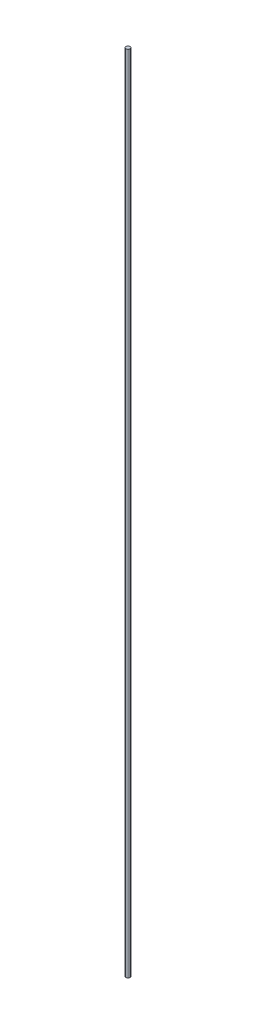
ISO-10303-21;
HEADER;
FILE_DESCRIPTION(('STEP AP214'),'2;1');
FILE_NAME('part.step','',(''),(''),'','','');
FILE_SCHEMA(('AUTOMOTIVE_DESIGN { 1 0 10303 214 1 1 1 1 }'));
ENDSEC;
DATA;
#1=APPLICATION_CONTEXT('core data for automotive mechanical design processes');
#2=APPLICATION_PROTOCOL_DEFINITION('international standard','automotive_design',2000,#1);
#3=PRODUCT_CONTEXT('',#1,'mechanical');
#4=PRODUCT('Part','Part','',(#3));
#5=PRODUCT_RELATED_PRODUCT_CATEGORY('part','',(#4));
#6=PRODUCT_DEFINITION_FORMATION('','',#4);
#7=PRODUCT_DEFINITION_CONTEXT('part definition',#1,'design');
#8=PRODUCT_DEFINITION('design','',#6,#7);
#9=PRODUCT_DEFINITION_SHAPE('','',#8);
#10=(LENGTH_UNIT() NAMED_UNIT(*) SI_UNIT(.MILLI.,.METRE.));
#11=(NAMED_UNIT(*) PLANE_ANGLE_UNIT() SI_UNIT($,.RADIAN.));
#12=(NAMED_UNIT(*) SI_UNIT($,.STERADIAN.) SOLID_ANGLE_UNIT());
#13=UNCERTAINTY_MEASURE_WITH_UNIT(LENGTH_MEASURE(1.E-05),#10,'distance_accuracy_value','');
#14=(GEOMETRIC_REPRESENTATION_CONTEXT(3) GLOBAL_UNCERTAINTY_ASSIGNED_CONTEXT((#13)) GLOBAL_UNIT_ASSIGNED_CONTEXT((#10,
#11,#12)) REPRESENTATION_CONTEXT('',''));
#15=CARTESIAN_POINT('',(0.,0.,0.));
#16=DIRECTION('',(0.,0.,1.));
#17=DIRECTION('',(1.,0.,0.));
#18=AXIS2_PLACEMENT_3D('',#15,#16,#17);
#19=CARTESIAN_POINT('',(0.,1270.,0.));
#20=DIRECTION('',(0.,-1.,0.));
#21=DIRECTION('',(0.,0.,-1.));
#22=AXIS2_PLACEMENT_3D('',#19,#20,#21);
#23=CYLINDRICAL_SURFACE('',#22,3.175);
#24=CARTESIAN_POINT('',(0.,1270.,0.));
#25=DIRECTION('',(0.,1.,0.));
#26=DIRECTION('',(0.,0.,1.));
#27=AXIS2_PLACEMENT_3D('',#24,#25,#26);
#28=CIRCLE('',#27,3.175);
#29=CARTESIAN_POINT('',(0.,1270.,-3.175));
#30=VERTEX_POINT('',#29);
#31=EDGE_CURVE('E10',#30,#30,#28,.T.);
#32=CARTESIAN_POINT('',(0.,0.,0.));
#33=DIRECTION('',(0.,1.,0.));
#34=DIRECTION('',(0.,0.,1.));
#35=AXIS2_PLACEMENT_3D('',#32,#33,#34);
#36=CIRCLE('',#35,3.175);
#37=CARTESIAN_POINT('',(0.,-2.22044604925031E-13,-3.175));
#38=VERTEX_POINT('',#37);
#39=EDGE_CURVE('E40',#38,#38,#36,.T.);
#40=CARTESIAN_POINT('',(0.,1270.,-3.175));
#41=CARTESIAN_POINT('',(0.,1256.77083333333,-3.175));
#42=CARTESIAN_POINT('',(0.,1243.54166666667,-3.175));
#43=CARTESIAN_POINT('',(0.,1217.08333333333,-3.175));
#44=CARTESIAN_POINT('',(0.,1203.85416666667,-3.175));
#45=CARTESIAN_POINT('',(0.,1177.39583333333,-3.175));
#46=CARTESIAN_POINT('',(0.,1164.16666666667,-3.175));
#47=CARTESIAN_POINT('',(0.,1137.70833333333,-3.175));
#48=CARTESIAN_POINT('',(0.,1124.47916666667,-3.175));
#49=CARTESIAN_POINT('',(0.,1098.02083333333,-3.175));
#50=CARTESIAN_POINT('',(0.,1084.79166666667,-3.175));
#51=CARTESIAN_POINT('',(0.,1058.33333333333,-3.175));
#52=CARTESIAN_POINT('',(0.,1045.10416666667,-3.175));
#53=CARTESIAN_POINT('',(0.,1018.64583333333,-3.175));
#54=CARTESIAN_POINT('',(0.,1005.41666666667,-3.175));
#55=CARTESIAN_POINT('',(0.,978.958333333333,-3.175));
#56=CARTESIAN_POINT('',(0.,965.729166666667,-3.175));
#57=CARTESIAN_POINT('',(0.,939.270833333333,-3.175));
#58=CARTESIAN_POINT('',(0.,926.041666666667,-3.175));
#59=CARTESIAN_POINT('',(0.,899.583333333333,-3.175));
#60=CARTESIAN_POINT('',(0.,886.354166666666,-3.175));
#61=CARTESIAN_POINT('',(0.,859.895833333333,-3.175));
#62=CARTESIAN_POINT('',(0.,846.666666666666,-3.175));
#63=CARTESIAN_POINT('',(0.,820.208333333333,-3.175));
#64=CARTESIAN_POINT('',(0.,806.979166666667,-3.175));
#65=CARTESIAN_POINT('',(0.,780.520833333333,-3.175));
#66=CARTESIAN_POINT('',(0.,767.291666666667,-3.175));
#67=CARTESIAN_POINT('',(0.,740.833333333333,-3.175));
#68=CARTESIAN_POINT('',(0.,727.604166666667,-3.175));
#69=CARTESIAN_POINT('',(0.,701.145833333333,-3.175));
#70=CARTESIAN_POINT('',(0.,687.916666666666,-3.175));
#71=CARTESIAN_POINT('',(0.,661.458333333333,-3.175));
#72=CARTESIAN_POINT('',(0.,648.229166666666,-3.175));
#73=CARTESIAN_POINT('',(0.,621.770833333333,-3.175));
#74=CARTESIAN_POINT('',(0.,608.541666666666,-3.175));
#75=CARTESIAN_POINT('',(0.,582.083333333333,-3.175));
#76=CARTESIAN_POINT('',(0.,568.854166666666,-3.175));
#77=CARTESIAN_POINT('',(0.,542.395833333333,-3.175));
#78=CARTESIAN_POINT('',(0.,529.166666666666,-3.175));
#79=CARTESIAN_POINT('',(0.,502.708333333333,-3.175));
#80=CARTESIAN_POINT('',(0.,489.479166666666,-3.175));
#81=CARTESIAN_POINT('',(0.,463.020833333333,-3.175));
#82=CARTESIAN_POINT('',(0.,449.791666666666,-3.175));
#83=CARTESIAN_POINT('',(0.,423.333333333333,-3.175));
#84=CARTESIAN_POINT('',(0.,410.104166666666,-3.175));
#85=CARTESIAN_POINT('',(0.,383.645833333333,-3.175));
#86=CARTESIAN_POINT('',(0.,370.416666666666,-3.175));
#87=CARTESIAN_POINT('',(0.,343.958333333333,-3.175));
#88=CARTESIAN_POINT('',(0.,330.729166666666,-3.175));
#89=CARTESIAN_POINT('',(0.,304.270833333333,-3.175));
#90=CARTESIAN_POINT('',(0.,291.041666666666,-3.175));
#91=CARTESIAN_POINT('',(0.,264.583333333333,-3.175));
#92=CARTESIAN_POINT('',(0.,251.354166666666,-3.175));
#93=CARTESIAN_POINT('',(0.,224.895833333333,-3.175));
#94=CARTESIAN_POINT('',(0.,211.666666666667,-3.175));
#95=CARTESIAN_POINT('',(0.,185.208333333333,-3.175));
#96=CARTESIAN_POINT('',(0.,171.979166666666,-3.175));
#97=CARTESIAN_POINT('',(0.,145.520833333333,-3.175));
#98=CARTESIAN_POINT('',(0.,132.291666666666,-3.175));
#99=CARTESIAN_POINT('',(0.,105.833333333333,-3.175));
#100=CARTESIAN_POINT('',(0.,92.6041666666664,-3.175));
#101=CARTESIAN_POINT('',(0.,66.1458333333331,-3.175));
#102=CARTESIAN_POINT('',(0.,52.9166666666665,-3.175));
#103=CARTESIAN_POINT('',(0.,26.4583333333332,-3.175));
#104=CARTESIAN_POINT('',(0.,13.2291666666665,-3.175));
#105=CARTESIAN_POINT('',(0.,-2.22044604925031E-13,-3.175));
#106=B_SPLINE_CURVE_WITH_KNOTS('',3,(#40,#41,#42,#43,#44,#45,#46,#47,#48,#49,#50,#51,#52,#53,
#54,#55,#56,#57,#58,#59,#60,#61,#62,#63,#64,#65,#66,#67,#68,#69,#70,#71,#72,#73,#74,#75,#76,#77,
#78,#79,#80,#81,#82,#83,#84,#85,#86,#87,#88,#89,#90,#91,#92,#93,#94,#95,#96,#97,#98,#99,#100,
#101,#102,#103,#104,#105),.UNSPECIFIED.,.F.,.F.,(4,2,2,2,2,2,2,2,2,2,2,2,2,2,2,2,2,2,2,2,2,2,2,
2,2,2,2,2,2,2,2,2,4),(0.,39.6875000000001,79.3750000000002,119.0625,158.75,198.4375,238.125,
277.8125,317.5,357.1875,396.875,436.5625,476.25,515.9375,555.625,595.3125,635.,674.6875,714.375,
754.0625,793.75,833.4375,873.125,912.8125,952.5,992.1875,1031.875,1071.5625,1111.25,1150.9375,
1190.625,1230.3125,1270.),.UNSPECIFIED.);
#107=EDGE_CURVE('BSEAM37',#30,#38,#106,.T.);
#108=ORIENTED_EDGE('',*,*,#31,.F.);
#109=ORIENTED_EDGE('',*,*,#39,.T.);
#110=ORIENTED_EDGE('',*,*,#107,.T.);
#111=ORIENTED_EDGE('',*,*,#107,.F.);
#112=EDGE_LOOP('',(#108,#110,#109,#111));
#113=FACE_BOUND('',#112,.T.);
#114=ADVANCED_FACE('F37',(#113),#23,.T.);
#115=CARTESIAN_POINT('',(0.,1270.,0.));
#116=DIRECTION('',(0.,1.,0.));
#117=DIRECTION('',(0.,0.,1.));
#118=AXIS2_PLACEMENT_3D('',#115,#116,#117);
#119=PLANE('',#118);
#120=ORIENTED_EDGE('',*,*,#31,.T.);
#121=EDGE_LOOP('',(#120));
#122=FACE_BOUND('',#121,.T.);
#123=ADVANCED_FACE('F54',(#122),#119,.T.);
#124=CARTESIAN_POINT('',(0.,0.,0.));
#125=DIRECTION('',(0.,1.,0.));
#126=DIRECTION('',(0.,0.,1.));
#127=AXIS2_PLACEMENT_3D('',#124,#125,#126);
#128=PLANE('',#127);
#129=ORIENTED_EDGE('',*,*,#39,.F.);
#130=EDGE_LOOP('',(#129));
#131=FACE_BOUND('',#130,.T.);
#132=ADVANCED_FACE('F52',(#131),#128,.F.);
#133=CLOSED_SHELL('',(#114,#123,#132));
#134=MANIFOLD_SOLID_BREP('B2',#133);
#135=ADVANCED_BREP_SHAPE_REPRESENTATION('',(#18,#134),#14);
#136=SHAPE_DEFINITION_REPRESENTATION(#9,#135);
ENDSEC;
END-ISO-10303-21;
